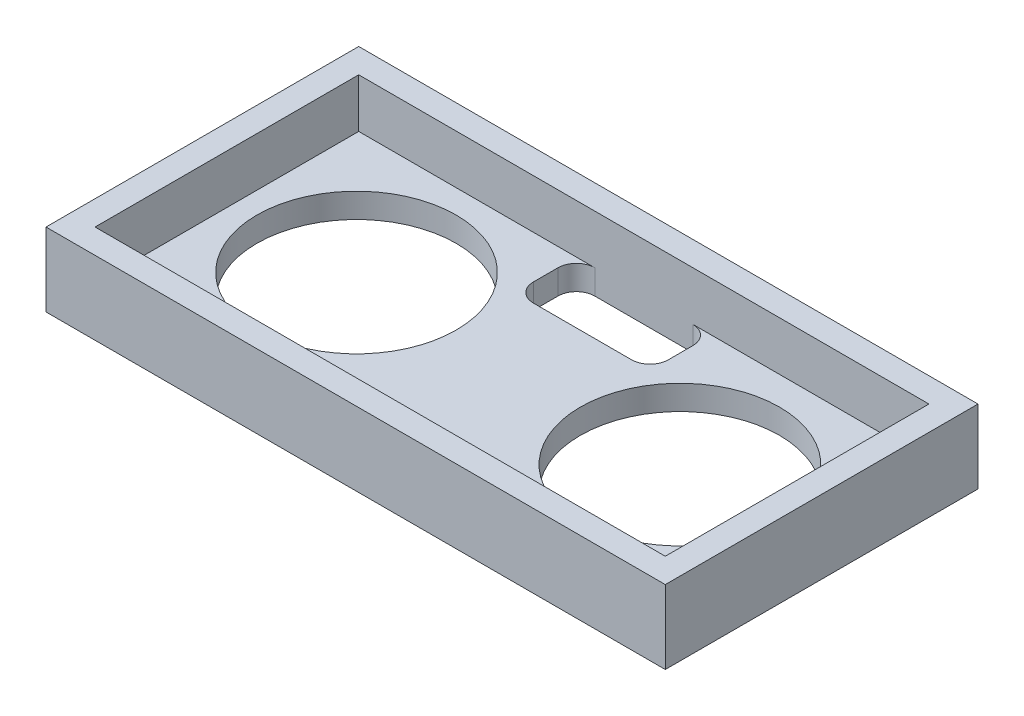
ISO-10303-21;
HEADER;
FILE_DESCRIPTION(('STEP AP214'),'2;1');
FILE_NAME('part.step','',(''),(''),'','','');
FILE_SCHEMA(('AUTOMOTIVE_DESIGN { 1 0 10303 214 1 1 1 1 }'));
ENDSEC;
DATA;
#1=APPLICATION_CONTEXT('core data for automotive mechanical design processes');
#2=APPLICATION_PROTOCOL_DEFINITION('international standard','automotive_design',2000,#1);
#3=PRODUCT_CONTEXT('',#1,'mechanical');
#4=PRODUCT('Part','Part','',(#3));
#5=PRODUCT_RELATED_PRODUCT_CATEGORY('part','',(#4));
#6=PRODUCT_DEFINITION_FORMATION('','',#4);
#7=PRODUCT_DEFINITION_CONTEXT('part definition',#1,'design');
#8=PRODUCT_DEFINITION('design','',#6,#7);
#9=PRODUCT_DEFINITION_SHAPE('','',#8);
#10=(LENGTH_UNIT() NAMED_UNIT(*) SI_UNIT(.MILLI.,.METRE.));
#11=(NAMED_UNIT(*) PLANE_ANGLE_UNIT() SI_UNIT($,.RADIAN.));
#12=(NAMED_UNIT(*) SI_UNIT($,.STERADIAN.) SOLID_ANGLE_UNIT());
#13=UNCERTAINTY_MEASURE_WITH_UNIT(LENGTH_MEASURE(1.E-05),#10,'distance_accuracy_value','');
#14=(GEOMETRIC_REPRESENTATION_CONTEXT(3) GLOBAL_UNCERTAINTY_ASSIGNED_CONTEXT((#13)) GLOBAL_UNIT_ASSIGNED_CONTEXT((#10,
#11,#12)) REPRESENTATION_CONTEXT('',''));
#15=CARTESIAN_POINT('',(0.,0.,0.));
#16=DIRECTION('',(0.,0.,1.));
#17=DIRECTION('',(1.,0.,0.));
#18=AXIS2_PLACEMENT_3D('',#15,#16,#17);
#19=CARTESIAN_POINT('',(0.,6.,0.));
#20=DIRECTION('',(0.,1.,0.));
#21=DIRECTION('',(0.,0.,1.));
#22=AXIS2_PLACEMENT_3D('',#19,#20,#21);
#23=PLANE('',#22);
#24=DIRECTION('',(0.,0.,1.));
#25=VECTOR('',#24,1.);
#26=CARTESIAN_POINT('',(-32.2386154697513,6.,-14.1150234741784));
#27=LINE('',#26,#25);
#28=CARTESIAN_POINT('',(-32.2386154697513,6.,-14.1150234741784));
#29=VERTEX_POINT('',#28);
#30=CARTESIAN_POINT('',(-32.2386154697513,6.,11.3849765258216));
#31=VERTEX_POINT('',#30);
#32=EDGE_CURVE('E217',#29,#31,#27,.T.);
#33=ORIENTED_EDGE('',*,*,#32,.T.);
#34=DIRECTION('',(1.,0.,0.));
#35=VECTOR('',#34,1.);
#36=CARTESIAN_POINT('',(-32.2386154697513,6.,11.3849765258216));
#37=LINE('',#36,#35);
#38=CARTESIAN_POINT('',(18.2613845302487,6.,11.3849765258216));
#39=VERTEX_POINT('',#38);
#40=EDGE_CURVE('E220',#31,#39,#37,.T.);
#41=ORIENTED_EDGE('',*,*,#40,.T.);
#42=DIRECTION('',(0.,0.,-1.));
#43=VECTOR('',#42,1.);
#44=CARTESIAN_POINT('',(18.2613845302487,6.,-14.1150234741784));
#45=LINE('',#44,#43);
#46=CARTESIAN_POINT('',(18.2613845302487,6.,-14.1150234741784));
#47=VERTEX_POINT('',#46);
#48=EDGE_CURVE('E225',#39,#47,#45,.T.);
#49=ORIENTED_EDGE('',*,*,#48,.T.);
#50=DIRECTION('',(-1.,0.,0.));
#51=VECTOR('',#50,1.);
#52=CARTESIAN_POINT('',(-32.2386154697513,6.,-14.1150234741784));
#53=LINE('',#52,#51);
#54=EDGE_CURVE('E222',#47,#29,#53,.T.);
#55=ORIENTED_EDGE('',*,*,#54,.T.);
#56=EDGE_LOOP('',(#33,#41,#49,#55));
#57=FACE_BOUND('',#56,.T.);
#58=DIRECTION('',(-1.,0.,0.));
#59=VECTOR('',#58,1.);
#60=CARTESIAN_POINT('',(0.,6.,9.38497652582159));
#61=LINE('',#60,#59);
#62=CARTESIAN_POINT('',(16.2613845302487,6.,9.38497652582159));
#63=VERTEX_POINT('',#62);
#64=CARTESIAN_POINT('',(-30.2386154697513,6.,9.38497652582159));
#65=VERTEX_POINT('',#64);
#66=EDGE_CURVE('E228',#63,#65,#61,.T.);
#67=ORIENTED_EDGE('',*,*,#66,.T.);
#68=DIRECTION('',(0.,0.,-1.));
#69=VECTOR('',#68,1.);
#70=CARTESIAN_POINT('',(-30.2386154697513,6.,0.));
#71=LINE('',#70,#69);
#72=CARTESIAN_POINT('',(-30.2386154697513,6.,-12.1150234741784));
#73=VERTEX_POINT('',#72);
#74=EDGE_CURVE('E37',#65,#73,#71,.T.);
#75=ORIENTED_EDGE('',*,*,#74,.T.);
#76=DIRECTION('',(1.,0.,0.));
#77=VECTOR('',#76,1.);
#78=CARTESIAN_POINT('',(0.,6.,-12.1150234741784));
#79=LINE('',#78,#77);
#80=CARTESIAN_POINT('',(16.2613845302487,6.,-12.1150234741784));
#81=VERTEX_POINT('',#80);
#82=EDGE_CURVE('E83',#73,#81,#79,.T.);
#83=ORIENTED_EDGE('',*,*,#82,.T.);
#84=DIRECTION('',(0.,0.,1.));
#85=VECTOR('',#84,1.);
#86=CARTESIAN_POINT('',(16.2613845302487,6.,0.));
#87=LINE('',#86,#85);
#88=EDGE_CURVE('E231',#81,#63,#87,.T.);
#89=ORIENTED_EDGE('',*,*,#88,.T.);
#90=EDGE_LOOP('',(#67,#75,#83,#89));
#91=FACE_BOUND('',#90,.T.);
#92=ADVANCED_FACE('F34',(#57,#91),#23,.T.);
#93=CARTESIAN_POINT('',(-32.2386154697513,2.,-14.1150234741784));
#94=DIRECTION('',(1.,0.,0.));
#95=DIRECTION('',(0.,0.,-1.));
#96=AXIS2_PLACEMENT_3D('',#93,#94,#95);
#97=PLANE('',#96);
#98=DIRECTION('',(0.,0.,1.));
#99=VECTOR('',#98,1.);
#100=CARTESIAN_POINT('',(-32.2386154697513,0.,-14.1150234741784));
#101=LINE('',#100,#99);
#102=CARTESIAN_POINT('',(-32.2386154697513,0.,-14.1150234741784));
#103=VERTEX_POINT('',#102);
#104=CARTESIAN_POINT('',(-32.2386154697513,0.,11.3849765258216));
#105=VERTEX_POINT('',#104);
#106=EDGE_CURVE('E367',#103,#105,#101,.T.);
#107=ORIENTED_EDGE('',*,*,#106,.T.);
#108=DIRECTION('',(0.,-1.,0.));
#109=VECTOR('',#108,1.);
#110=CARTESIAN_POINT('',(-32.2386154697513,2.,11.3849765258216));
#111=LINE('',#110,#109);
#112=EDGE_CURVE('E233',#31,#105,#111,.T.);
#113=ORIENTED_EDGE('',*,*,#112,.F.);
#114=ORIENTED_EDGE('',*,*,#32,.F.);
#115=DIRECTION('',(0.,-1.,0.));
#116=VECTOR('',#115,1.);
#117=CARTESIAN_POINT('',(-32.2386154697513,2.,-14.1150234741784));
#118=LINE('',#117,#116);
#119=EDGE_CURVE('E224',#29,#103,#118,.T.);
#120=ORIENTED_EDGE('',*,*,#119,.T.);
#121=EDGE_LOOP('',(#107,#113,#114,#120));
#122=FACE_BOUND('',#121,.T.);
#123=ADVANCED_FACE('F388',(#122),#97,.F.);
#124=CARTESIAN_POINT('',(-32.2386154697513,2.,11.3849765258216));
#125=DIRECTION('',(0.,0.,-1.));
#126=DIRECTION('',(-1.,0.,0.));
#127=AXIS2_PLACEMENT_3D('',#124,#125,#126);
#128=PLANE('',#127);
#129=DIRECTION('',(1.,0.,0.));
#130=VECTOR('',#129,1.);
#131=CARTESIAN_POINT('',(-32.2386154697513,0.,11.3849765258216));
#132=LINE('',#131,#130);
#133=CARTESIAN_POINT('',(18.2613845302487,0.,11.3849765258216));
#134=VERTEX_POINT('',#133);
#135=EDGE_CURVE('E369',#105,#134,#132,.T.);
#136=ORIENTED_EDGE('',*,*,#135,.T.);
#137=DIRECTION('',(0.,-1.,0.));
#138=VECTOR('',#137,1.);
#139=CARTESIAN_POINT('',(18.2613845302487,2.,11.3849765258216));
#140=LINE('',#139,#138);
#141=EDGE_CURVE('E237',#39,#134,#140,.T.);
#142=ORIENTED_EDGE('',*,*,#141,.F.);
#143=ORIENTED_EDGE('',*,*,#40,.F.);
#144=ORIENTED_EDGE('',*,*,#112,.T.);
#145=EDGE_LOOP('',(#136,#142,#143,#144));
#146=FACE_BOUND('',#145,.T.);
#147=ADVANCED_FACE('F393',(#146),#128,.F.);
#148=CARTESIAN_POINT('',(18.2613845302487,2.,-14.1150234741784));
#149=DIRECTION('',(-1.,0.,0.));
#150=DIRECTION('',(0.,0.,1.));
#151=AXIS2_PLACEMENT_3D('',#148,#149,#150);
#152=PLANE('',#151);
#153=DIRECTION('',(0.,0.,-1.));
#154=VECTOR('',#153,1.);
#155=CARTESIAN_POINT('',(18.2613845302487,0.,-14.1150234741784));
#156=LINE('',#155,#154);
#157=CARTESIAN_POINT('',(18.2613845302487,0.,-14.1150234741784));
#158=VERTEX_POINT('',#157);
#159=EDGE_CURVE('E371',#134,#158,#156,.T.);
#160=ORIENTED_EDGE('',*,*,#159,.T.);
#161=DIRECTION('',(0.,-1.,0.));
#162=VECTOR('',#161,1.);
#163=CARTESIAN_POINT('',(18.2613845302487,2.,-14.1150234741784));
#164=LINE('',#163,#162);
#165=EDGE_CURVE('E243',#47,#158,#164,.T.);
#166=ORIENTED_EDGE('',*,*,#165,.F.);
#167=ORIENTED_EDGE('',*,*,#48,.F.);
#168=ORIENTED_EDGE('',*,*,#141,.T.);
#169=EDGE_LOOP('',(#160,#166,#167,#168));
#170=FACE_BOUND('',#169,.T.);
#171=ADVANCED_FACE('F392',(#170),#152,.F.);
#172=CARTESIAN_POINT('',(-32.2386154697513,2.,-14.1150234741784));
#173=DIRECTION('',(0.,0.,1.));
#174=DIRECTION('',(1.,0.,0.));
#175=AXIS2_PLACEMENT_3D('',#172,#173,#174);
#176=PLANE('',#175);
#177=DIRECTION('',(-1.,0.,0.));
#178=VECTOR('',#177,1.);
#179=CARTESIAN_POINT('',(-32.2386154697513,0.,-14.1150234741784));
#180=LINE('',#179,#178);
#181=EDGE_CURVE('E221',#158,#103,#180,.T.);
#182=ORIENTED_EDGE('',*,*,#181,.T.);
#183=ORIENTED_EDGE('',*,*,#119,.F.);
#184=ORIENTED_EDGE('',*,*,#54,.F.);
#185=ORIENTED_EDGE('',*,*,#165,.T.);
#186=EDGE_LOOP('',(#182,#183,#184,#185));
#187=FACE_BOUND('',#186,.T.);
#188=ADVANCED_FACE('F380',(#187),#176,.F.);
#189=CARTESIAN_POINT('',(0.,0.,0.));
#190=DIRECTION('',(0.,1.,0.));
#191=DIRECTION('',(0.,0.,1.));
#192=AXIS2_PLACEMENT_3D('',#189,#190,#191);
#193=PLANE('',#192);
#194=CARTESIAN_POINT('',(-2.98861546975133,0.,8.38497652582159));
#195=DIRECTION('',(0.,1.,0.));
#196=DIRECTION('',(0.,0.,1.));
#197=AXIS2_PLACEMENT_3D('',#194,#195,#196);
#198=CIRCLE('',#197,1.);
#199=CARTESIAN_POINT('',(-2.98861546975133,0.,9.38497652582159));
#200=VERTEX_POINT('',#199);
#201=CARTESIAN_POINT('',(-1.98861546975133,0.,8.38497652582159));
#202=VERTEX_POINT('',#201);
#203=EDGE_CURVE('E181',#200,#202,#198,.T.);
#204=ORIENTED_EDGE('',*,*,#203,.T.);
#205=CARTESIAN_POINT('',(-2.98861546975133,0.,8.38497652582159));
#206=DIRECTION('',(0.,1.,0.));
#207=DIRECTION('',(0.,0.,1.));
#208=AXIS2_PLACEMENT_3D('',#205,#206,#207);
#209=CIRCLE('',#208,1.);
#210=CARTESIAN_POINT('',(-2.98861546975133,0.,7.38497652582159));
#211=VERTEX_POINT('',#210);
#212=EDGE_CURVE('E185',#202,#211,#209,.T.);
#213=ORIENTED_EDGE('',*,*,#212,.T.);
#214=DIRECTION('',(-1.,0.,0.));
#215=VECTOR('',#214,1.);
#216=CARTESIAN_POINT('',(0.,0.,7.38497652582159));
#217=LINE('',#216,#215);
#218=CARTESIAN_POINT('',(-10.9886154697513,0.,7.38497652582159));
#219=VERTEX_POINT('',#218);
#220=EDGE_CURVE('E311',#211,#219,#217,.T.);
#221=ORIENTED_EDGE('',*,*,#220,.T.);
#222=CARTESIAN_POINT('',(-10.9886154697513,0.,8.38497652582159));
#223=DIRECTION('',(0.,1.,0.));
#224=DIRECTION('',(0.,0.,1.));
#225=AXIS2_PLACEMENT_3D('',#222,#223,#224);
#226=CIRCLE('',#225,1.);
#227=CARTESIAN_POINT('',(-11.9886154697513,0.,8.38497652582159));
#228=VERTEX_POINT('',#227);
#229=EDGE_CURVE('E51',#219,#228,#226,.T.);
#230=ORIENTED_EDGE('',*,*,#229,.T.);
#231=CARTESIAN_POINT('',(-10.9886154697513,0.,8.38497652582159));
#232=DIRECTION('',(0.,1.,0.));
#233=DIRECTION('',(0.,0.,1.));
#234=AXIS2_PLACEMENT_3D('',#231,#232,#233);
#235=CIRCLE('',#234,1.);
#236=CARTESIAN_POINT('',(-10.9886154697513,0.,9.38497652582159));
#237=VERTEX_POINT('',#236);
#238=EDGE_CURVE('E12',#228,#237,#235,.T.);
#239=ORIENTED_EDGE('',*,*,#238,.T.);
#240=DIRECTION('',(1.,0.,0.));
#241=VECTOR('',#240,1.);
#242=CARTESIAN_POINT('',(0.,0.,9.38497652582159));
#243=LINE('',#242,#241);
#244=EDGE_CURVE('E188',#237,#200,#243,.T.);
#245=ORIENTED_EDGE('',*,*,#244,.T.);
#246=EDGE_LOOP('',(#204,#213,#221,#230,#239,#245));
#247=FACE_BOUND('',#246,.T.);
#248=DIRECTION('',(0.,0.,-1.));
#249=VECTOR('',#248,1.);
#250=CARTESIAN_POINT('',(-1.48861546975133,0.,0.));
#251=LINE('',#250,#249);
#252=CARTESIAN_POINT('',(-1.48861546975133,0.,-8.61502347417841));
#253=VERTEX_POINT('',#252);
#254=CARTESIAN_POINT('',(-1.48861546975133,0.,-10.6150234741784));
#255=VERTEX_POINT('',#254);
#256=EDGE_CURVE('E327',#253,#255,#251,.T.);
#257=ORIENTED_EDGE('',*,*,#256,.T.);
#258=CARTESIAN_POINT('',(-2.98861546975133,0.,-10.6150234741784));
#259=DIRECTION('',(0.,1.,0.));
#260=DIRECTION('',(0.,0.,1.));
#261=AXIS2_PLACEMENT_3D('',#258,#259,#260);
#262=CIRCLE('',#261,1.5);
#263=CARTESIAN_POINT('',(-2.98861546975133,0.,-12.1150234741784));
#264=VERTEX_POINT('',#263);
#265=EDGE_CURVE('E273',#255,#264,#262,.T.);
#266=ORIENTED_EDGE('',*,*,#265,.T.);
#267=DIRECTION('',(-1.,0.,0.));
#268=VECTOR('',#267,1.);
#269=CARTESIAN_POINT('',(0.,0.,-12.1150234741784));
#270=LINE('',#269,#268);
#271=CARTESIAN_POINT('',(-10.9886154697513,0.,-12.1150234741784));
#272=VERTEX_POINT('',#271);
#273=EDGE_CURVE('E330',#264,#272,#270,.T.);
#274=ORIENTED_EDGE('',*,*,#273,.T.);
#275=CARTESIAN_POINT('',(-10.9886154697513,0.,-10.6150234741784));
#276=DIRECTION('',(0.,1.,0.));
#277=DIRECTION('',(0.,0.,1.));
#278=AXIS2_PLACEMENT_3D('',#275,#276,#277);
#279=CIRCLE('',#278,1.5);
#280=CARTESIAN_POINT('',(-12.4886154697513,0.,-10.6150234741784));
#281=VERTEX_POINT('',#280);
#282=EDGE_CURVE('E277',#272,#281,#279,.T.);
#283=ORIENTED_EDGE('',*,*,#282,.T.);
#284=DIRECTION('',(0.,0.,1.));
#285=VECTOR('',#284,1.);
#286=CARTESIAN_POINT('',(-12.4886154697513,0.,0.));
#287=LINE('',#286,#285);
#288=CARTESIAN_POINT('',(-12.4886154697513,0.,-8.61502347417841));
#289=VERTEX_POINT('',#288);
#290=EDGE_CURVE('E333',#281,#289,#287,.T.);
#291=ORIENTED_EDGE('',*,*,#290,.T.);
#292=CARTESIAN_POINT('',(-10.9886154697513,0.,-8.61502347417841));
#293=DIRECTION('',(0.,1.,0.));
#294=DIRECTION('',(0.,0.,1.));
#295=AXIS2_PLACEMENT_3D('',#292,#293,#294);
#296=CIRCLE('',#295,1.5);
#297=CARTESIAN_POINT('',(-10.9886154697513,0.,-7.11502347417841));
#298=VERTEX_POINT('',#297);
#299=EDGE_CURVE('E281',#289,#298,#296,.T.);
#300=ORIENTED_EDGE('',*,*,#299,.T.);
#301=DIRECTION('',(1.,0.,0.));
#302=VECTOR('',#301,1.);
#303=CARTESIAN_POINT('',(0.,0.,-7.11502347417841));
#304=LINE('',#303,#302);
#305=CARTESIAN_POINT('',(-2.98861546975133,0.,-7.11502347417841));
#306=VERTEX_POINT('',#305);
#307=EDGE_CURVE('E324',#298,#306,#304,.T.);
#308=ORIENTED_EDGE('',*,*,#307,.T.);
#309=CARTESIAN_POINT('',(-2.98861546975133,0.,-8.61502347417841));
#310=DIRECTION('',(0.,1.,0.));
#311=DIRECTION('',(0.,0.,1.));
#312=AXIS2_PLACEMENT_3D('',#309,#310,#311);
#313=CIRCLE('',#312,1.5);
#314=EDGE_CURVE('E269',#306,#253,#313,.T.);
#315=ORIENTED_EDGE('',*,*,#314,.T.);
#316=EDGE_LOOP('',(#257,#266,#274,#283,#291,#300,#308,#315));
#317=FACE_BOUND('',#316,.T.);
#318=CARTESIAN_POINT('',(-20.3636154697513,0.,-2.06192687971907));
#319=DIRECTION('',(0.,1.,0.));
#320=DIRECTION('',(0.,0.,1.));
#321=AXIS2_PLACEMENT_3D('',#318,#319,#320);
#322=CIRCLE('',#321,8.125);
#323=CARTESIAN_POINT('',(-20.3636154697513,0.,6.06307312028093));
#324=VERTEX_POINT('',#323);
#325=EDGE_CURVE('E345',#324,#324,#322,.T.);
#326=ORIENTED_EDGE('',*,*,#325,.T.);
#327=EDGE_LOOP('',(#326));
#328=FACE_BOUND('',#327,.T.);
#329=CARTESIAN_POINT('',(6.38638453024867,0.,-1.68317443612409));
#330=DIRECTION('',(0.,1.,0.));
#331=DIRECTION('',(0.,0.,1.));
#332=AXIS2_PLACEMENT_3D('',#329,#330,#331);
#333=CIRCLE('',#332,8.125);
#334=CARTESIAN_POINT('',(6.38638453024867,0.,6.44182556387591));
#335=VERTEX_POINT('',#334);
#336=EDGE_CURVE('E340',#335,#335,#333,.T.);
#337=ORIENTED_EDGE('',*,*,#336,.T.);
#338=EDGE_LOOP('',(#337));
#339=FACE_BOUND('',#338,.T.);
#340=ORIENTED_EDGE('',*,*,#106,.F.);
#341=ORIENTED_EDGE('',*,*,#181,.F.);
#342=ORIENTED_EDGE('',*,*,#159,.F.);
#343=ORIENTED_EDGE('',*,*,#135,.F.);
#344=EDGE_LOOP('',(#340,#341,#342,#343));
#345=FACE_BOUND('',#344,.T.);
#346=ADVANCED_FACE('F183',(#247,#317,#328,#339,#345),#193,.F.);
#347=CARTESIAN_POINT('',(-30.2386154697513,14.,-12.1150234741784));
#348=DIRECTION('',(1.,0.,0.));
#349=DIRECTION('',(0.,0.,-1.));
#350=AXIS2_PLACEMENT_3D('',#347,#348,#349);
#351=PLANE('',#350);
#352=DIRECTION('',(0.,-1.,0.));
#353=VECTOR('',#352,1.);
#354=CARTESIAN_POINT('',(-30.2386154697513,14.,9.38497652582159));
#355=LINE('',#354,#353);
#356=CARTESIAN_POINT('',(-30.2386154697513,1.9999,9.38497652582159));
#357=VERTEX_POINT('',#356);
#358=EDGE_CURVE('E364',#65,#357,#355,.T.);
#359=ORIENTED_EDGE('',*,*,#358,.T.);
#360=DIRECTION('',(0.,0.,1.));
#361=VECTOR('',#360,1.);
#362=CARTESIAN_POINT('',(-30.2386154697513,1.9999,-12.1150234741784));
#363=LINE('',#362,#361);
#364=CARTESIAN_POINT('',(-30.2386154697513,1.9999,-12.1150234741784));
#365=VERTEX_POINT('',#364);
#366=EDGE_CURVE('E348',#365,#357,#363,.T.);
#367=ORIENTED_EDGE('',*,*,#366,.F.);
#368=DIRECTION('',(0.,-1.,0.));
#369=VECTOR('',#368,1.);
#370=CARTESIAN_POINT('',(-30.2386154697513,14.,-12.1150234741784));
#371=LINE('',#370,#369);
#372=EDGE_CURVE('E357',#73,#365,#371,.T.);
#373=ORIENTED_EDGE('',*,*,#372,.F.);
#374=ORIENTED_EDGE('',*,*,#74,.F.);
#375=EDGE_LOOP('',(#359,#367,#373,#374));
#376=FACE_BOUND('',#375,.T.);
#377=ADVANCED_FACE('F442',(#376),#351,.T.);
#378=CARTESIAN_POINT('',(-30.2386154697513,14.,9.38497652582159));
#379=DIRECTION('',(0.,0.,-1.));
#380=DIRECTION('',(-1.,0.,0.));
#381=AXIS2_PLACEMENT_3D('',#378,#379,#380);
#382=PLANE('',#381);
#383=DIRECTION('',(1.,0.,0.));
#384=VECTOR('',#383,1.);
#385=CARTESIAN_POINT('',(-30.2386154697513,1.9999,9.38497652582159));
#386=LINE('',#385,#384);
#387=CARTESIAN_POINT('',(-2.98861546975133,1.9999,9.38497652582159));
#388=VERTEX_POINT('',#387);
#389=CARTESIAN_POINT('',(16.2613845302487,1.9999,9.38497652582159));
#390=VERTEX_POINT('',#389);
#391=EDGE_CURVE('E350',#388,#390,#386,.T.);
#392=ORIENTED_EDGE('',*,*,#391,.F.);
#393=DIRECTION('',(0.,1.,0.));
#394=VECTOR('',#393,1.);
#395=CARTESIAN_POINT('',(-2.98861546975133,14.,9.38497652582159));
#396=LINE('',#395,#394);
#397=EDGE_CURVE('E286',#388,#200,#396,.F.);
#398=ORIENTED_EDGE('',*,*,#397,.T.);
#399=ORIENTED_EDGE('',*,*,#244,.F.);
#400=DIRECTION('',(0.,1.,0.));
#401=VECTOR('',#400,1.);
#402=CARTESIAN_POINT('',(-10.9886154697513,14.,9.38497652582159));
#403=LINE('',#402,#401);
#404=CARTESIAN_POINT('',(-10.9886154697513,1.9999,9.38497652582159));
#405=VERTEX_POINT('',#404);
#406=EDGE_CURVE('E283',#237,#405,#403,.T.);
#407=ORIENTED_EDGE('',*,*,#406,.T.);
#408=EDGE_CURVE('E302',#357,#405,#386,.T.);
#409=ORIENTED_EDGE('',*,*,#408,.F.);
#410=ORIENTED_EDGE('',*,*,#358,.F.);
#411=ORIENTED_EDGE('',*,*,#66,.F.);
#412=DIRECTION('',(0.,-1.,0.));
#413=VECTOR('',#412,1.);
#414=CARTESIAN_POINT('',(16.2613845302487,14.,9.38497652582159));
#415=LINE('',#414,#413);
#416=EDGE_CURVE('E361',#63,#390,#415,.T.);
#417=ORIENTED_EDGE('',*,*,#416,.T.);
#418=EDGE_LOOP('',(#392,#398,#399,#407,#409,#410,#411,#417));
#419=FACE_BOUND('',#418,.T.);
#420=ADVANCED_FACE('F450',(#419),#382,.T.);
#421=CARTESIAN_POINT('',(16.2613845302487,14.,-12.1150234741784));
#422=DIRECTION('',(-1.,0.,0.));
#423=DIRECTION('',(0.,0.,1.));
#424=AXIS2_PLACEMENT_3D('',#421,#422,#423);
#425=PLANE('',#424);
#426=DIRECTION('',(0.,-1.,0.));
#427=VECTOR('',#426,1.);
#428=CARTESIAN_POINT('',(16.2613845302487,14.,-12.1150234741784));
#429=LINE('',#428,#427);
#430=CARTESIAN_POINT('',(16.2613845302487,1.9999,-12.1150234741784));
#431=VERTEX_POINT('',#430);
#432=EDGE_CURVE('E359',#81,#431,#429,.T.);
#433=ORIENTED_EDGE('',*,*,#432,.T.);
#434=DIRECTION('',(0.,0.,-1.));
#435=VECTOR('',#434,1.);
#436=CARTESIAN_POINT('',(16.2613845302487,1.9999,-12.1150234741784));
#437=LINE('',#436,#435);
#438=EDGE_CURVE('E352',#390,#431,#437,.T.);
#439=ORIENTED_EDGE('',*,*,#438,.F.);
#440=ORIENTED_EDGE('',*,*,#416,.F.);
#441=ORIENTED_EDGE('',*,*,#88,.F.);
#442=EDGE_LOOP('',(#433,#439,#440,#441));
#443=FACE_BOUND('',#442,.T.);
#444=ADVANCED_FACE('F461',(#443),#425,.T.);
#445=CARTESIAN_POINT('',(-30.2386154697513,14.,-12.1150234741784));
#446=DIRECTION('',(0.,0.,1.));
#447=DIRECTION('',(1.,0.,0.));
#448=AXIS2_PLACEMENT_3D('',#445,#446,#447);
#449=PLANE('',#448);
#450=ORIENTED_EDGE('',*,*,#273,.F.);
#451=DIRECTION('',(0.,1.,0.));
#452=VECTOR('',#451,1.);
#453=CARTESIAN_POINT('',(-2.98861546975133,14.,-12.1150234741784));
#454=LINE('',#453,#452);
#455=CARTESIAN_POINT('',(-2.98861546975134,1.9999,-12.1150234741784));
#456=VERTEX_POINT('',#455);
#457=EDGE_CURVE('E259',#264,#456,#454,.T.);
#458=ORIENTED_EDGE('',*,*,#457,.T.);
#459=DIRECTION('',(-1.,0.,0.));
#460=VECTOR('',#459,1.);
#461=CARTESIAN_POINT('',(-30.2386154697513,1.9999,-12.1150234741784));
#462=LINE('',#461,#460);
#463=EDGE_CURVE('E355',#431,#456,#462,.T.);
#464=ORIENTED_EDGE('',*,*,#463,.F.);
#465=ORIENTED_EDGE('',*,*,#432,.F.);
#466=ORIENTED_EDGE('',*,*,#82,.F.);
#467=ORIENTED_EDGE('',*,*,#372,.T.);
#468=CARTESIAN_POINT('',(-10.9886154697513,1.9999,-12.1150234741784));
#469=VERTEX_POINT('',#468);
#470=EDGE_CURVE('E92',#469,#365,#462,.T.);
#471=ORIENTED_EDGE('',*,*,#470,.F.);
#472=DIRECTION('',(0.,1.,0.));
#473=VECTOR('',#472,1.);
#474=CARTESIAN_POINT('',(-10.9886154697513,14.,-12.1150234741784));
#475=LINE('',#474,#473);
#476=EDGE_CURVE('E257',#469,#272,#475,.F.);
#477=ORIENTED_EDGE('',*,*,#476,.T.);
#478=EDGE_LOOP('',(#450,#458,#464,#465,#466,#467,#471,#477));
#479=FACE_BOUND('',#478,.T.);
#480=ADVANCED_FACE('F473',(#479),#449,.T.);
#481=CARTESIAN_POINT('',(0.,1.9999,0.));
#482=DIRECTION('',(0.,1.,0.));
#483=DIRECTION('',(0.,0.,1.));
#484=AXIS2_PLACEMENT_3D('',#481,#482,#483);
#485=PLANE('',#484);
#486=ORIENTED_EDGE('',*,*,#408,.T.);
#487=CARTESIAN_POINT('',(-10.9886154697513,1.9999,8.38497652582159));
#488=DIRECTION('',(0.,1.,0.));
#489=DIRECTION('',(0.,0.,1.));
#490=AXIS2_PLACEMENT_3D('',#487,#488,#489);
#491=CIRCLE('',#490,1.);
#492=CARTESIAN_POINT('',(-11.9886154697513,1.9999,8.38497652582159));
#493=VERTEX_POINT('',#492);
#494=EDGE_CURVE('E43',#405,#493,#491,.F.);
#495=ORIENTED_EDGE('',*,*,#494,.T.);
#496=CARTESIAN_POINT('',(-10.9886154697513,1.9999,8.38497652582159));
#497=DIRECTION('',(0.,1.,0.));
#498=DIRECTION('',(0.,0.,1.));
#499=AXIS2_PLACEMENT_3D('',#496,#497,#498);
#500=CIRCLE('',#499,1.);
#501=CARTESIAN_POINT('',(-10.9886154697513,1.9999,7.38497652582159));
#502=VERTEX_POINT('',#501);
#503=EDGE_CURVE('E204',#493,#502,#500,.F.);
#504=ORIENTED_EDGE('',*,*,#503,.T.);
#505=DIRECTION('',(-1.,0.,0.));
#506=VECTOR('',#505,1.);
#507=CARTESIAN_POINT('',(-11.9886154697513,1.9999,7.38497652582159));
#508=LINE('',#507,#506);
#509=CARTESIAN_POINT('',(-2.98861546975133,1.9999,7.38497652582159));
#510=VERTEX_POINT('',#509);
#511=EDGE_CURVE('E208',#510,#502,#508,.T.);
#512=ORIENTED_EDGE('',*,*,#511,.F.);
#513=CARTESIAN_POINT('',(-2.98861546975133,1.9999,8.38497652582159));
#514=DIRECTION('',(0.,1.,0.));
#515=DIRECTION('',(0.,0.,1.));
#516=AXIS2_PLACEMENT_3D('',#513,#514,#515);
#517=CIRCLE('',#516,1.);
#518=CARTESIAN_POINT('',(-1.98861546975133,1.9999,8.38497652582159));
#519=VERTEX_POINT('',#518);
#520=EDGE_CURVE('E193',#510,#519,#517,.F.);
#521=ORIENTED_EDGE('',*,*,#520,.T.);
#522=CARTESIAN_POINT('',(-2.98861546975133,1.9999,8.38497652582159));
#523=DIRECTION('',(0.,1.,0.));
#524=DIRECTION('',(0.,0.,1.));
#525=AXIS2_PLACEMENT_3D('',#522,#523,#524);
#526=CIRCLE('',#525,1.);
#527=EDGE_CURVE('E194',#519,#388,#526,.F.);
#528=ORIENTED_EDGE('',*,*,#527,.T.);
#529=ORIENTED_EDGE('',*,*,#391,.T.);
#530=ORIENTED_EDGE('',*,*,#438,.T.);
#531=ORIENTED_EDGE('',*,*,#463,.T.);
#532=CARTESIAN_POINT('',(-2.98861546975133,1.9999,-10.6150234741784));
#533=DIRECTION('',(0.,1.,0.));
#534=DIRECTION('',(0.,0.,1.));
#535=AXIS2_PLACEMENT_3D('',#532,#533,#534);
#536=CIRCLE('',#535,1.5);
#537=CARTESIAN_POINT('',(-1.48861546975133,1.9999,-10.6150234741784));
#538=VERTEX_POINT('',#537);
#539=EDGE_CURVE('E271',#456,#538,#536,.F.);
#540=ORIENTED_EDGE('',*,*,#539,.T.);
#541=DIRECTION('',(0.,0.,-1.));
#542=VECTOR('',#541,1.);
#543=CARTESIAN_POINT('',(-1.48861546975133,1.9999,-12.1150234741784));
#544=LINE('',#543,#542);
#545=CARTESIAN_POINT('',(-1.48861546975133,1.9999,-8.61502347417841));
#546=VERTEX_POINT('',#545);
#547=EDGE_CURVE('E321',#546,#538,#544,.T.);
#548=ORIENTED_EDGE('',*,*,#547,.F.);
#549=CARTESIAN_POINT('',(-2.98861546975133,1.9999,-8.61502347417841));
#550=DIRECTION('',(0.,1.,0.));
#551=DIRECTION('',(0.,0.,1.));
#552=AXIS2_PLACEMENT_3D('',#549,#550,#551);
#553=CIRCLE('',#552,1.5);
#554=CARTESIAN_POINT('',(-2.98861546975133,1.9999,-7.11502347417841));
#555=VERTEX_POINT('',#554);
#556=EDGE_CURVE('E267',#546,#555,#553,.F.);
#557=ORIENTED_EDGE('',*,*,#556,.T.);
#558=DIRECTION('',(1.,0.,0.));
#559=VECTOR('',#558,1.);
#560=CARTESIAN_POINT('',(-12.4886154697513,1.9999,-7.11502347417841));
#561=LINE('',#560,#559);
#562=CARTESIAN_POINT('',(-10.9886154697513,1.9999,-7.11502347417841));
#563=VERTEX_POINT('',#562);
#564=EDGE_CURVE('E315',#563,#555,#561,.T.);
#565=ORIENTED_EDGE('',*,*,#564,.F.);
#566=CARTESIAN_POINT('',(-10.9886154697513,1.9999,-8.61502347417841));
#567=DIRECTION('',(0.,1.,0.));
#568=DIRECTION('',(0.,0.,1.));
#569=AXIS2_PLACEMENT_3D('',#566,#567,#568);
#570=CIRCLE('',#569,1.5);
#571=CARTESIAN_POINT('',(-12.4886154697513,1.9999,-8.61502347417841));
#572=VERTEX_POINT('',#571);
#573=EDGE_CURVE('E279',#563,#572,#570,.F.);
#574=ORIENTED_EDGE('',*,*,#573,.T.);
#575=DIRECTION('',(0.,0.,1.));
#576=VECTOR('',#575,1.);
#577=CARTESIAN_POINT('',(-12.4886154697513,1.9999,-12.1150234741784));
#578=LINE('',#577,#576);
#579=CARTESIAN_POINT('',(-12.4886154697513,1.9999,-10.6150234741784));
#580=VERTEX_POINT('',#579);
#581=EDGE_CURVE('E312',#580,#572,#578,.T.);
#582=ORIENTED_EDGE('',*,*,#581,.F.);
#583=CARTESIAN_POINT('',(-10.9886154697513,1.9999,-10.6150234741784));
#584=DIRECTION('',(0.,1.,0.));
#585=DIRECTION('',(0.,0.,1.));
#586=AXIS2_PLACEMENT_3D('',#583,#584,#585);
#587=CIRCLE('',#586,1.5);
#588=EDGE_CURVE('E275',#580,#469,#587,.F.);
#589=ORIENTED_EDGE('',*,*,#588,.T.);
#590=ORIENTED_EDGE('',*,*,#470,.T.);
#591=ORIENTED_EDGE('',*,*,#366,.T.);
#592=EDGE_LOOP('',(#486,#495,#504,#512,#521,#528,#529,#530,#531,#540,#548,#557,#565,#574,#582,
#589,#590,#591));
#593=FACE_BOUND('',#592,.T.);
#594=CARTESIAN_POINT('',(-20.3636154697513,1.9999,-2.06192687971907));
#595=DIRECTION('',(0.,1.,0.));
#596=DIRECTION('',(0.,0.,1.));
#597=AXIS2_PLACEMENT_3D('',#594,#595,#596);
#598=CIRCLE('',#597,8.125);
#599=CARTESIAN_POINT('',(-20.3636154697513,1.9999,6.06307312028093));
#600=VERTEX_POINT('',#599);
#601=EDGE_CURVE('E337',#600,#600,#598,.T.);
#602=ORIENTED_EDGE('',*,*,#601,.F.);
#603=EDGE_LOOP('',(#602));
#604=FACE_BOUND('',#603,.T.);
#605=CARTESIAN_POINT('',(6.38638453024867,1.9999,-1.68317443612409));
#606=DIRECTION('',(0.,1.,0.));
#607=DIRECTION('',(0.,0.,1.));
#608=AXIS2_PLACEMENT_3D('',#605,#606,#607);
#609=CIRCLE('',#608,8.125);
#610=CARTESIAN_POINT('',(6.38638453024867,1.9999,6.44182556387591));
#611=VERTEX_POINT('',#610);
#612=EDGE_CURVE('E336',#611,#611,#609,.T.);
#613=ORIENTED_EDGE('',*,*,#612,.F.);
#614=EDGE_LOOP('',(#613));
#615=FACE_BOUND('',#614,.T.);
#616=ADVANCED_FACE('F297',(#593,#604,#615),#485,.T.);
#617=CARTESIAN_POINT('',(6.38638453024867,-8.0002,-1.68317443612409));
#618=DIRECTION('',(0.,1.,0.));
#619=DIRECTION('',(0.,0.,1.));
#620=AXIS2_PLACEMENT_3D('',#617,#618,#619);
#621=CYLINDRICAL_SURFACE('',#620,8.125);
#622=ORIENTED_EDGE('',*,*,#612,.T.);
#623=EDGE_LOOP('',(#622));
#624=FACE_BOUND('',#623,.T.);
#625=ORIENTED_EDGE('',*,*,#336,.F.);
#626=EDGE_LOOP('',(#625));
#627=FACE_BOUND('',#626,.T.);
#628=ADVANCED_FACE('F492',(#624,#627),#621,.F.);
#629=CARTESIAN_POINT('',(-20.3636154697513,-8.0002,-2.06192687971907));
#630=DIRECTION('',(0.,1.,0.));
#631=DIRECTION('',(0.,0.,1.));
#632=AXIS2_PLACEMENT_3D('',#629,#630,#631);
#633=CYLINDRICAL_SURFACE('',#632,8.125);
#634=ORIENTED_EDGE('',*,*,#601,.T.);
#635=EDGE_LOOP('',(#634));
#636=FACE_BOUND('',#635,.T.);
#637=ORIENTED_EDGE('',*,*,#325,.F.);
#638=EDGE_LOOP('',(#637));
#639=FACE_BOUND('',#638,.T.);
#640=ADVANCED_FACE('F500',(#636,#639),#633,.F.);
#641=CARTESIAN_POINT('',(-12.4886154697513,-8.0002,-12.1150234741784));
#642=DIRECTION('',(-1.,0.,0.));
#643=DIRECTION('',(0.,0.,1.));
#644=AXIS2_PLACEMENT_3D('',#641,#642,#643);
#645=PLANE('',#644);
#646=ORIENTED_EDGE('',*,*,#290,.F.);
#647=DIRECTION('',(0.,1.,0.));
#648=VECTOR('',#647,1.);
#649=CARTESIAN_POINT('',(-12.4886154697513,-8.0002,-10.6150234741784));
#650=LINE('',#649,#648);
#651=EDGE_CURVE('E264',#281,#580,#650,.T.);
#652=ORIENTED_EDGE('',*,*,#651,.T.);
#653=ORIENTED_EDGE('',*,*,#581,.T.);
#654=DIRECTION('',(0.,1.,0.));
#655=VECTOR('',#654,1.);
#656=CARTESIAN_POINT('',(-12.4886154697513,0.,-8.61502347417841));
#657=LINE('',#656,#655);
#658=EDGE_CURVE('E262',#572,#289,#657,.F.);
#659=ORIENTED_EDGE('',*,*,#658,.T.);
#660=EDGE_LOOP('',(#646,#652,#653,#659));
#661=FACE_BOUND('',#660,.T.);
#662=ADVANCED_FACE('F508',(#661),#645,.F.);
#663=CARTESIAN_POINT('',(-1.48861546975133,-8.0002,-12.1150234741784));
#664=DIRECTION('',(1.,0.,0.));
#665=DIRECTION('',(0.,0.,-1.));
#666=AXIS2_PLACEMENT_3D('',#663,#664,#665);
#667=PLANE('',#666);
#668=ORIENTED_EDGE('',*,*,#256,.F.);
#669=DIRECTION('',(0.,1.,0.));
#670=VECTOR('',#669,1.);
#671=CARTESIAN_POINT('',(-1.48861546975133,1.9999,-8.61502347417841));
#672=LINE('',#671,#670);
#673=EDGE_CURVE('E249',#253,#546,#672,.T.);
#674=ORIENTED_EDGE('',*,*,#673,.T.);
#675=ORIENTED_EDGE('',*,*,#547,.T.);
#676=DIRECTION('',(0.,1.,0.));
#677=VECTOR('',#676,1.);
#678=CARTESIAN_POINT('',(-1.48861546975133,-8.0002,-10.6150234741784));
#679=LINE('',#678,#677);
#680=EDGE_CURVE('E247',#538,#255,#679,.F.);
#681=ORIENTED_EDGE('',*,*,#680,.T.);
#682=EDGE_LOOP('',(#668,#674,#675,#681));
#683=FACE_BOUND('',#682,.T.);
#684=ADVANCED_FACE('F515',(#683),#667,.F.);
#685=CARTESIAN_POINT('',(-12.4886154697513,-8.0002,-7.11502347417841));
#686=DIRECTION('',(0.,0.,1.));
#687=DIRECTION('',(1.,0.,0.));
#688=AXIS2_PLACEMENT_3D('',#685,#686,#687);
#689=PLANE('',#688);
#690=ORIENTED_EDGE('',*,*,#564,.T.);
#691=DIRECTION('',(0.,1.,0.));
#692=VECTOR('',#691,1.);
#693=CARTESIAN_POINT('',(-2.98861546975133,0.,-7.11502347417841));
#694=LINE('',#693,#692);
#695=EDGE_CURVE('E255',#555,#306,#694,.F.);
#696=ORIENTED_EDGE('',*,*,#695,.T.);
#697=ORIENTED_EDGE('',*,*,#307,.F.);
#698=DIRECTION('',(0.,1.,0.));
#699=VECTOR('',#698,1.);
#700=CARTESIAN_POINT('',(-10.9886154697513,1.9999,-7.11502347417841));
#701=LINE('',#700,#699);
#702=EDGE_CURVE('E252',#298,#563,#701,.T.);
#703=ORIENTED_EDGE('',*,*,#702,.T.);
#704=EDGE_LOOP('',(#690,#696,#697,#703));
#705=FACE_BOUND('',#704,.T.);
#706=ADVANCED_FACE('F522',(#705),#689,.F.);
#707=CARTESIAN_POINT('',(-2.98861546975133,-8.0002,-8.61502347417841));
#708=DIRECTION('',(0.,-1.,0.));
#709=DIRECTION('',(0.,0.,-1.));
#710=AXIS2_PLACEMENT_3D('',#707,#708,#709);
#711=CYLINDRICAL_SURFACE('',#710,1.5);
#712=ORIENTED_EDGE('',*,*,#314,.F.);
#713=ORIENTED_EDGE('',*,*,#695,.F.);
#714=ORIENTED_EDGE('',*,*,#556,.F.);
#715=ORIENTED_EDGE('',*,*,#673,.F.);
#716=EDGE_LOOP('',(#712,#713,#714,#715));
#717=FACE_BOUND('',#716,.T.);
#718=ADVANCED_FACE('F530',(#717),#711,.F.);
#719=CARTESIAN_POINT('',(-2.98861546975133,14.,-10.6150234741784));
#720=DIRECTION('',(0.,1.,0.));
#721=DIRECTION('',(0.,0.,1.));
#722=AXIS2_PLACEMENT_3D('',#719,#720,#721);
#723=CYLINDRICAL_SURFACE('',#722,1.5);
#724=ORIENTED_EDGE('',*,*,#265,.F.);
#725=ORIENTED_EDGE('',*,*,#680,.F.);
#726=ORIENTED_EDGE('',*,*,#539,.F.);
#727=ORIENTED_EDGE('',*,*,#457,.F.);
#728=EDGE_LOOP('',(#724,#725,#726,#727));
#729=FACE_BOUND('',#728,.T.);
#730=ADVANCED_FACE('F538',(#729),#723,.F.);
#731=CARTESIAN_POINT('',(-10.9886154697513,-8.0002,-10.6150234741784));
#732=DIRECTION('',(0.,1.,0.));
#733=DIRECTION('',(0.,0.,1.));
#734=AXIS2_PLACEMENT_3D('',#731,#732,#733);
#735=CYLINDRICAL_SURFACE('',#734,1.5);
#736=ORIENTED_EDGE('',*,*,#282,.F.);
#737=ORIENTED_EDGE('',*,*,#476,.F.);
#738=ORIENTED_EDGE('',*,*,#588,.F.);
#739=ORIENTED_EDGE('',*,*,#651,.F.);
#740=EDGE_LOOP('',(#736,#737,#738,#739));
#741=FACE_BOUND('',#740,.T.);
#742=ADVANCED_FACE('F546',(#741),#735,.F.);
#743=CARTESIAN_POINT('',(-10.9886154697513,-8.0002,-8.61502347417841));
#744=DIRECTION('',(0.,-1.,0.));
#745=DIRECTION('',(0.,0.,-1.));
#746=AXIS2_PLACEMENT_3D('',#743,#744,#745);
#747=CYLINDRICAL_SURFACE('',#746,1.5);
#748=ORIENTED_EDGE('',*,*,#299,.F.);
#749=ORIENTED_EDGE('',*,*,#658,.F.);
#750=ORIENTED_EDGE('',*,*,#573,.F.);
#751=ORIENTED_EDGE('',*,*,#702,.F.);
#752=EDGE_LOOP('',(#748,#749,#750,#751));
#753=FACE_BOUND('',#752,.T.);
#754=ADVANCED_FACE('F554',(#753),#747,.F.);
#755=CARTESIAN_POINT('',(-11.9886154697513,-8.0002,7.38497652582159));
#756=DIRECTION('',(0.,0.,-1.));
#757=DIRECTION('',(-1.,0.,0.));
#758=AXIS2_PLACEMENT_3D('',#755,#756,#757);
#759=PLANE('',#758);
#760=ORIENTED_EDGE('',*,*,#220,.F.);
#761=DIRECTION('',(0.,1.,0.));
#762=VECTOR('',#761,1.);
#763=CARTESIAN_POINT('',(-2.98861546975133,1.9999,7.38497652582159));
#764=LINE('',#763,#762);
#765=EDGE_CURVE('E203',#211,#510,#764,.T.);
#766=ORIENTED_EDGE('',*,*,#765,.T.);
#767=ORIENTED_EDGE('',*,*,#511,.T.);
#768=DIRECTION('',(0.,1.,0.));
#769=VECTOR('',#768,1.);
#770=CARTESIAN_POINT('',(-10.9886154697513,0.,7.38497652582159));
#771=LINE('',#770,#769);
#772=EDGE_CURVE('E288',#502,#219,#771,.F.);
#773=ORIENTED_EDGE('',*,*,#772,.T.);
#774=EDGE_LOOP('',(#760,#766,#767,#773));
#775=FACE_BOUND('',#774,.T.);
#776=ADVANCED_FACE('F310',(#775),#759,.F.);
#777=CARTESIAN_POINT('',(-2.98861546975133,-8.0002,8.38497652582159));
#778=DIRECTION('',(0.,-1.,0.));
#779=DIRECTION('',(0.,0.,-1.));
#780=AXIS2_PLACEMENT_3D('',#777,#778,#779);
#781=CYLINDRICAL_SURFACE('',#780,1.);
#782=ORIENTED_EDGE('',*,*,#765,.F.);
#783=ORIENTED_EDGE('',*,*,#212,.F.);
#784=DIRECTION('',(0.,1.,0.));
#785=VECTOR('',#784,1.);
#786=CARTESIAN_POINT('',(-1.98861546975133,0.,8.38497652582159));
#787=LINE('',#786,#785);
#788=EDGE_CURVE('E201',#519,#202,#787,.F.);
#789=ORIENTED_EDGE('',*,*,#788,.F.);
#790=ORIENTED_EDGE('',*,*,#520,.F.);
#791=EDGE_LOOP('',(#782,#783,#789,#790));
#792=FACE_BOUND('',#791,.T.);
#793=ADVANCED_FACE('F199',(#792),#781,.F.);
#794=CARTESIAN_POINT('',(-2.98861546975133,-8.0002,8.38497652582159));
#795=DIRECTION('',(0.,1.,0.));
#796=DIRECTION('',(0.,0.,1.));
#797=AXIS2_PLACEMENT_3D('',#794,#795,#796);
#798=CYLINDRICAL_SURFACE('',#797,1.);
#799=ORIENTED_EDGE('',*,*,#203,.F.);
#800=ORIENTED_EDGE('',*,*,#397,.F.);
#801=ORIENTED_EDGE('',*,*,#527,.F.);
#802=ORIENTED_EDGE('',*,*,#788,.T.);
#803=EDGE_LOOP('',(#799,#800,#801,#802));
#804=FACE_BOUND('',#803,.T.);
#805=ADVANCED_FACE('F206',(#804),#798,.F.);
#806=CARTESIAN_POINT('',(-10.9886154697513,14.,8.38497652582159));
#807=DIRECTION('',(0.,1.,0.));
#808=DIRECTION('',(0.,0.,1.));
#809=AXIS2_PLACEMENT_3D('',#806,#807,#808);
#810=CYLINDRICAL_SURFACE('',#809,1.);
#811=ORIENTED_EDGE('',*,*,#406,.F.);
#812=ORIENTED_EDGE('',*,*,#238,.F.);
#813=DIRECTION('',(0.,1.,0.));
#814=VECTOR('',#813,1.);
#815=CARTESIAN_POINT('',(-11.9886154697513,-8.0002,8.38497652582159));
#816=LINE('',#815,#814);
#817=EDGE_CURVE('E209',#493,#228,#816,.F.);
#818=ORIENTED_EDGE('',*,*,#817,.F.);
#819=ORIENTED_EDGE('',*,*,#494,.F.);
#820=EDGE_LOOP('',(#811,#812,#818,#819));
#821=FACE_BOUND('',#820,.T.);
#822=ADVANCED_FACE('F305',(#821),#810,.F.);
#823=CARTESIAN_POINT('',(-10.9886154697513,-8.0002,8.38497652582159));
#824=DIRECTION('',(0.,-1.,0.));
#825=DIRECTION('',(0.,0.,-1.));
#826=AXIS2_PLACEMENT_3D('',#823,#824,#825);
#827=CYLINDRICAL_SURFACE('',#826,1.);
#828=ORIENTED_EDGE('',*,*,#229,.F.);
#829=ORIENTED_EDGE('',*,*,#772,.F.);
#830=ORIENTED_EDGE('',*,*,#503,.F.);
#831=ORIENTED_EDGE('',*,*,#817,.T.);
#832=EDGE_LOOP('',(#828,#829,#830,#831));
#833=FACE_BOUND('',#832,.T.);
#834=ADVANCED_FACE('F308',(#833),#827,.F.);
#835=CLOSED_SHELL('',(#92,#123,#147,#171,#188,#346,#377,#420,#444,#480,#616,#628,#640,#662,#684,
#706,#718,#730,#742,#754,#776,#793,#805,#822,#834));
#836=MANIFOLD_SOLID_BREP('B2',#835);
#837=ADVANCED_BREP_SHAPE_REPRESENTATION('',(#18,#836),#14);
#838=SHAPE_DEFINITION_REPRESENTATION(#9,#837);
ENDSEC;
END-ISO-10303-21;
